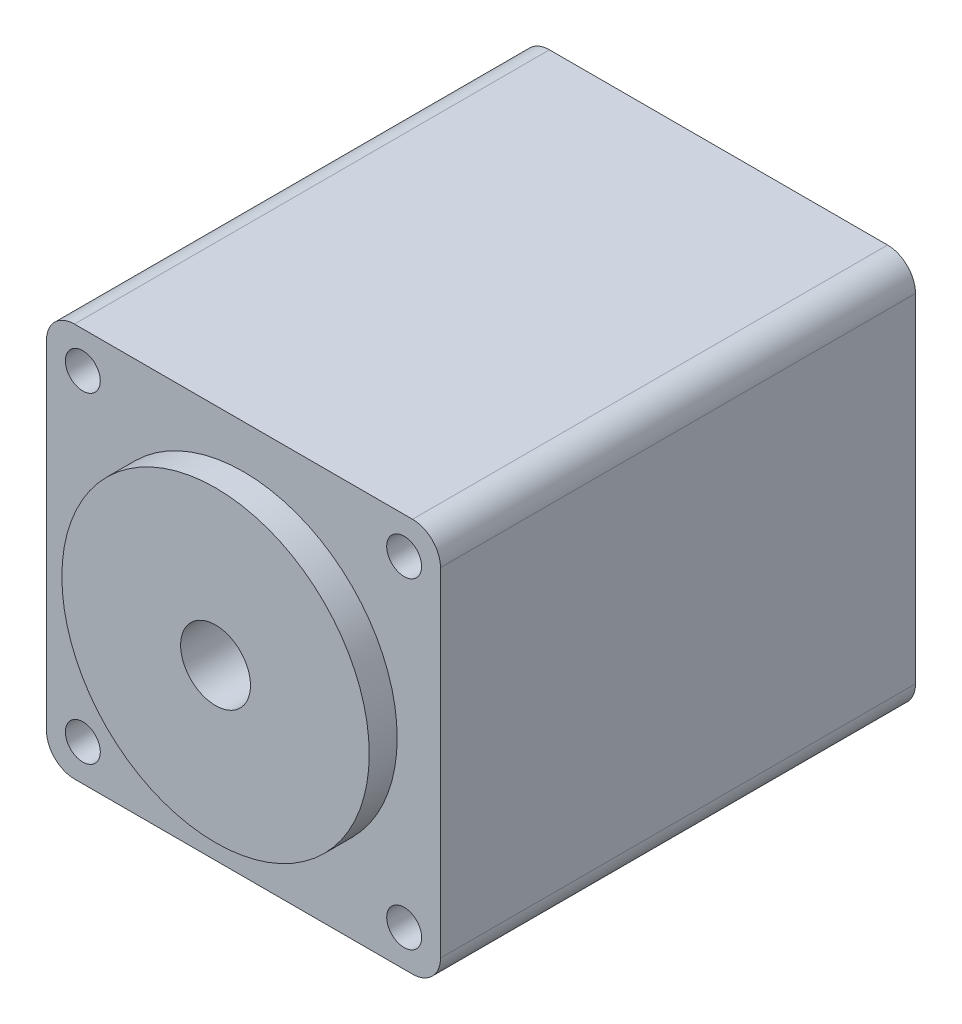
ISO-10303-21;
HEADER;
FILE_DESCRIPTION(('STEP AP214'),'2;1');
FILE_NAME('part.step','',(''),(''),'','','');
FILE_SCHEMA(('AUTOMOTIVE_DESIGN { 1 0 10303 214 1 1 1 1 }'));
ENDSEC;
DATA;
#1=APPLICATION_CONTEXT('core data for automotive mechanical design processes');
#2=APPLICATION_PROTOCOL_DEFINITION('international standard','automotive_design',2000,#1);
#3=PRODUCT_CONTEXT('',#1,'mechanical');
#4=PRODUCT('Part','Part','',(#3));
#5=PRODUCT_RELATED_PRODUCT_CATEGORY('part','',(#4));
#6=PRODUCT_DEFINITION_FORMATION('','',#4);
#7=PRODUCT_DEFINITION_CONTEXT('part definition',#1,'design');
#8=PRODUCT_DEFINITION('design','',#6,#7);
#9=PRODUCT_DEFINITION_SHAPE('','',#8);
#10=(LENGTH_UNIT() NAMED_UNIT(*) SI_UNIT(.MILLI.,.METRE.));
#11=(NAMED_UNIT(*) PLANE_ANGLE_UNIT() SI_UNIT($,.RADIAN.));
#12=(NAMED_UNIT(*) SI_UNIT($,.STERADIAN.) SOLID_ANGLE_UNIT());
#13=UNCERTAINTY_MEASURE_WITH_UNIT(LENGTH_MEASURE(1.E-05),#10,'distance_accuracy_value','');
#14=(GEOMETRIC_REPRESENTATION_CONTEXT(3) GLOBAL_UNCERTAINTY_ASSIGNED_CONTEXT((#13)) GLOBAL_UNIT_ASSIGNED_CONTEXT((#10,
#11,#12)) REPRESENTATION_CONTEXT('',''));
#15=CARTESIAN_POINT('',(0.,0.,0.));
#16=DIRECTION('',(0.,0.,1.));
#17=DIRECTION('',(1.,0.,0.));
#18=AXIS2_PLACEMENT_3D('',#15,#16,#17);
#19=CARTESIAN_POINT('',(-12.1,-12.1,34.));
#20=DIRECTION('',(0.,0.,-1.));
#21=DIRECTION('',(-1.,0.,0.));
#22=AXIS2_PLACEMENT_3D('',#19,#20,#21);
#23=CYLINDRICAL_SURFACE('',#22,2.);
#24=CARTESIAN_POINT('',(-12.1,-12.1,0.));
#25=DIRECTION('',(0.,0.,1.));
#26=DIRECTION('',(1.,0.,0.));
#27=AXIS2_PLACEMENT_3D('',#24,#25,#26);
#28=CIRCLE('',#27,2.);
#29=CARTESIAN_POINT('',(-14.1,-12.1,0.));
#30=VERTEX_POINT('',#29);
#31=CARTESIAN_POINT('',(-12.1,-14.1,0.));
#32=VERTEX_POINT('',#31);
#33=EDGE_CURVE('E130',#30,#32,#28,.T.);
#34=ORIENTED_EDGE('',*,*,#33,.T.);
#35=DIRECTION('',(0.,0.,-1.));
#36=VECTOR('',#35,1.);
#37=CARTESIAN_POINT('',(-12.1,-14.1,34.));
#38=LINE('',#37,#36);
#39=CARTESIAN_POINT('',(-12.1,-14.1,34.));
#40=VERTEX_POINT('',#39);
#41=EDGE_CURVE('E35',#40,#32,#38,.T.);
#42=ORIENTED_EDGE('',*,*,#41,.F.);
#43=CARTESIAN_POINT('',(-12.1,-12.1,34.));
#44=DIRECTION('',(0.,0.,1.));
#45=DIRECTION('',(1.,0.,0.));
#46=AXIS2_PLACEMENT_3D('',#43,#44,#45);
#47=CIRCLE('',#46,2.);
#48=CARTESIAN_POINT('',(-14.1,-12.1,34.));
#49=VERTEX_POINT('',#48);
#50=EDGE_CURVE('E145',#49,#40,#47,.T.);
#51=ORIENTED_EDGE('',*,*,#50,.F.);
#52=DIRECTION('',(0.,0.,-1.));
#53=VECTOR('',#52,1.);
#54=CARTESIAN_POINT('',(-14.1,-12.1,34.));
#55=LINE('',#54,#53);
#56=EDGE_CURVE('E126',#49,#30,#55,.T.);
#57=ORIENTED_EDGE('',*,*,#56,.T.);
#58=EDGE_LOOP('',(#34,#42,#51,#57));
#59=FACE_BOUND('',#58,.T.);
#60=ADVANCED_FACE('F32',(#59),#23,.T.);
#61=CARTESIAN_POINT('',(-12.1,-14.1,34.));
#62=DIRECTION('',(0.,1.,0.));
#63=DIRECTION('',(0.,0.,1.));
#64=AXIS2_PLACEMENT_3D('',#61,#62,#63);
#65=PLANE('',#64);
#66=DIRECTION('',(1.,0.,0.));
#67=VECTOR('',#66,1.);
#68=CARTESIAN_POINT('',(-12.1,-14.1,0.));
#69=LINE('',#68,#67);
#70=CARTESIAN_POINT('',(12.1,-14.1,0.));
#71=VERTEX_POINT('',#70);
#72=EDGE_CURVE('E133',#32,#71,#69,.T.);
#73=ORIENTED_EDGE('',*,*,#72,.T.);
#74=DIRECTION('',(0.,0.,-1.));
#75=VECTOR('',#74,1.);
#76=CARTESIAN_POINT('',(12.1,-14.1,34.));
#77=LINE('',#76,#75);
#78=CARTESIAN_POINT('',(12.1,-14.1,34.));
#79=VERTEX_POINT('',#78);
#80=EDGE_CURVE('E154',#79,#71,#77,.T.);
#81=ORIENTED_EDGE('',*,*,#80,.F.);
#82=DIRECTION('',(1.,0.,0.));
#83=VECTOR('',#82,1.);
#84=CARTESIAN_POINT('',(-12.1,-14.1,34.));
#85=LINE('',#84,#83);
#86=EDGE_CURVE('E93',#40,#79,#85,.T.);
#87=ORIENTED_EDGE('',*,*,#86,.F.);
#88=ORIENTED_EDGE('',*,*,#41,.T.);
#89=EDGE_LOOP('',(#73,#81,#87,#88));
#90=FACE_BOUND('',#89,.T.);
#91=ADVANCED_FACE('F160',(#90),#65,.F.);
#92=CARTESIAN_POINT('',(12.1,-12.1,34.));
#93=DIRECTION('',(0.,0.,-1.));
#94=DIRECTION('',(-1.,0.,0.));
#95=AXIS2_PLACEMENT_3D('',#92,#93,#94);
#96=CYLINDRICAL_SURFACE('',#95,2.);
#97=CARTESIAN_POINT('',(12.1,-12.1,0.));
#98=DIRECTION('',(0.,0.,1.));
#99=DIRECTION('',(1.,0.,0.));
#100=AXIS2_PLACEMENT_3D('',#97,#98,#99);
#101=CIRCLE('',#100,2.);
#102=CARTESIAN_POINT('',(14.1,-12.1,0.));
#103=VERTEX_POINT('',#102);
#104=EDGE_CURVE('E136',#71,#103,#101,.T.);
#105=ORIENTED_EDGE('',*,*,#104,.T.);
#106=DIRECTION('',(0.,0.,-1.));
#107=VECTOR('',#106,1.);
#108=CARTESIAN_POINT('',(14.1,-12.1,34.));
#109=LINE('',#108,#107);
#110=CARTESIAN_POINT('',(14.1,-12.1,34.));
#111=VERTEX_POINT('',#110);
#112=EDGE_CURVE('E152',#111,#103,#109,.T.);
#113=ORIENTED_EDGE('',*,*,#112,.F.);
#114=CARTESIAN_POINT('',(12.1,-12.1,34.));
#115=DIRECTION('',(0.,0.,1.));
#116=DIRECTION('',(1.,0.,0.));
#117=AXIS2_PLACEMENT_3D('',#114,#115,#116);
#118=CIRCLE('',#117,2.);
#119=EDGE_CURVE('E175',#79,#111,#118,.T.);
#120=ORIENTED_EDGE('',*,*,#119,.F.);
#121=ORIENTED_EDGE('',*,*,#80,.T.);
#122=EDGE_LOOP('',(#105,#113,#120,#121));
#123=FACE_BOUND('',#122,.T.);
#124=ADVANCED_FACE('F169',(#123),#96,.T.);
#125=CARTESIAN_POINT('',(14.1,12.1,34.));
#126=DIRECTION('',(-1.,0.,0.));
#127=DIRECTION('',(0.,0.,1.));
#128=AXIS2_PLACEMENT_3D('',#125,#126,#127);
#129=PLANE('',#128);
#130=DIRECTION('',(0.,1.,0.));
#131=VECTOR('',#130,1.);
#132=CARTESIAN_POINT('',(14.1,12.1,0.));
#133=LINE('',#132,#131);
#134=CARTESIAN_POINT('',(14.1,12.1,0.));
#135=VERTEX_POINT('',#134);
#136=EDGE_CURVE('E138',#103,#135,#133,.T.);
#137=ORIENTED_EDGE('',*,*,#136,.T.);
#138=DIRECTION('',(0.,0.,-1.));
#139=VECTOR('',#138,1.);
#140=CARTESIAN_POINT('',(14.1,12.1,34.));
#141=LINE('',#140,#139);
#142=CARTESIAN_POINT('',(14.1,12.1,34.));
#143=VERTEX_POINT('',#142);
#144=EDGE_CURVE('E149',#143,#135,#141,.T.);
#145=ORIENTED_EDGE('',*,*,#144,.F.);
#146=DIRECTION('',(0.,1.,0.));
#147=VECTOR('',#146,1.);
#148=CARTESIAN_POINT('',(14.1,12.1,34.));
#149=LINE('',#148,#147);
#150=EDGE_CURVE('E174',#111,#143,#149,.T.);
#151=ORIENTED_EDGE('',*,*,#150,.F.);
#152=ORIENTED_EDGE('',*,*,#112,.T.);
#153=EDGE_LOOP('',(#137,#145,#151,#152));
#154=FACE_BOUND('',#153,.T.);
#155=ADVANCED_FACE('F172',(#154),#129,.F.);
#156=CARTESIAN_POINT('',(12.1,12.1,34.));
#157=DIRECTION('',(0.,0.,-1.));
#158=DIRECTION('',(-1.,0.,0.));
#159=AXIS2_PLACEMENT_3D('',#156,#157,#158);
#160=CYLINDRICAL_SURFACE('',#159,2.);
#161=CARTESIAN_POINT('',(12.1,12.1,0.));
#162=DIRECTION('',(0.,0.,1.));
#163=DIRECTION('',(-1.,0.,0.));
#164=AXIS2_PLACEMENT_3D('',#161,#162,#163);
#165=CIRCLE('',#164,2.);
#166=CARTESIAN_POINT('',(12.1,14.1,0.));
#167=VERTEX_POINT('',#166);
#168=EDGE_CURVE('E140',#135,#167,#165,.T.);
#169=ORIENTED_EDGE('',*,*,#168,.T.);
#170=DIRECTION('',(0.,0.,-1.));
#171=VECTOR('',#170,1.);
#172=CARTESIAN_POINT('',(12.1,14.1,34.));
#173=LINE('',#172,#171);
#174=CARTESIAN_POINT('',(12.1,14.1,34.));
#175=VERTEX_POINT('',#174);
#176=EDGE_CURVE('E121',#175,#167,#173,.T.);
#177=ORIENTED_EDGE('',*,*,#176,.F.);
#178=CARTESIAN_POINT('',(12.1,12.1,34.));
#179=DIRECTION('',(0.,0.,1.));
#180=DIRECTION('',(-1.,0.,0.));
#181=AXIS2_PLACEMENT_3D('',#178,#179,#180);
#182=CIRCLE('',#181,2.);
#183=EDGE_CURVE('E112',#143,#175,#182,.T.);
#184=ORIENTED_EDGE('',*,*,#183,.F.);
#185=ORIENTED_EDGE('',*,*,#144,.T.);
#186=EDGE_LOOP('',(#169,#177,#184,#185));
#187=FACE_BOUND('',#186,.T.);
#188=ADVANCED_FACE('F257',(#187),#160,.T.);
#189=CARTESIAN_POINT('',(-12.1,14.1,34.));
#190=DIRECTION('',(0.,-1.,0.));
#191=DIRECTION('',(0.,0.,-1.));
#192=AXIS2_PLACEMENT_3D('',#189,#190,#191);
#193=PLANE('',#192);
#194=DIRECTION('',(-1.,0.,0.));
#195=VECTOR('',#194,1.);
#196=CARTESIAN_POINT('',(-12.1,14.1,0.));
#197=LINE('',#196,#195);
#198=CARTESIAN_POINT('',(-12.1,14.1,0.));
#199=VERTEX_POINT('',#198);
#200=EDGE_CURVE('E120',#167,#199,#197,.T.);
#201=ORIENTED_EDGE('',*,*,#200,.T.);
#202=DIRECTION('',(0.,0.,-1.));
#203=VECTOR('',#202,1.);
#204=CARTESIAN_POINT('',(-12.1,14.1,34.));
#205=LINE('',#204,#203);
#206=CARTESIAN_POINT('',(-12.1,14.1,34.));
#207=VERTEX_POINT('',#206);
#208=EDGE_CURVE('E117',#207,#199,#205,.T.);
#209=ORIENTED_EDGE('',*,*,#208,.F.);
#210=DIRECTION('',(-1.,0.,0.));
#211=VECTOR('',#210,1.);
#212=CARTESIAN_POINT('',(-12.1,14.1,34.));
#213=LINE('',#212,#211);
#214=EDGE_CURVE('E106',#175,#207,#213,.T.);
#215=ORIENTED_EDGE('',*,*,#214,.F.);
#216=ORIENTED_EDGE('',*,*,#176,.T.);
#217=EDGE_LOOP('',(#201,#209,#215,#216));
#218=FACE_BOUND('',#217,.T.);
#219=ADVANCED_FACE('F118',(#218),#193,.F.);
#220=CARTESIAN_POINT('',(-12.1,12.1,34.));
#221=DIRECTION('',(0.,0.,-1.));
#222=DIRECTION('',(-1.,0.,0.));
#223=AXIS2_PLACEMENT_3D('',#220,#221,#222);
#224=CYLINDRICAL_SURFACE('',#223,2.);
#225=CARTESIAN_POINT('',(-12.1,12.1,0.));
#226=DIRECTION('',(0.,0.,1.));
#227=DIRECTION('',(1.,0.,0.));
#228=AXIS2_PLACEMENT_3D('',#225,#226,#227);
#229=CIRCLE('',#228,2.);
#230=CARTESIAN_POINT('',(-14.1,12.1,0.));
#231=VERTEX_POINT('',#230);
#232=EDGE_CURVE('E78',#199,#231,#229,.T.);
#233=ORIENTED_EDGE('',*,*,#232,.T.);
#234=DIRECTION('',(0.,0.,-1.));
#235=VECTOR('',#234,1.);
#236=CARTESIAN_POINT('',(-14.1,12.1,34.));
#237=LINE('',#236,#235);
#238=CARTESIAN_POINT('',(-14.1,12.1,34.));
#239=VERTEX_POINT('',#238);
#240=EDGE_CURVE('E122',#239,#231,#237,.T.);
#241=ORIENTED_EDGE('',*,*,#240,.F.);
#242=CARTESIAN_POINT('',(-12.1,12.1,34.));
#243=DIRECTION('',(0.,0.,1.));
#244=DIRECTION('',(1.,0.,0.));
#245=AXIS2_PLACEMENT_3D('',#242,#243,#244);
#246=CIRCLE('',#245,2.);
#247=EDGE_CURVE('E110',#207,#239,#246,.T.);
#248=ORIENTED_EDGE('',*,*,#247,.F.);
#249=ORIENTED_EDGE('',*,*,#208,.T.);
#250=EDGE_LOOP('',(#233,#241,#248,#249));
#251=FACE_BOUND('',#250,.T.);
#252=ADVANCED_FACE('F124',(#251),#224,.T.);
#253=CARTESIAN_POINT('',(-14.1,12.1,34.));
#254=DIRECTION('',(1.,0.,0.));
#255=DIRECTION('',(0.,0.,-1.));
#256=AXIS2_PLACEMENT_3D('',#253,#254,#255);
#257=PLANE('',#256);
#258=DIRECTION('',(0.,-1.,0.));
#259=VECTOR('',#258,1.);
#260=CARTESIAN_POINT('',(-14.1,12.1,0.));
#261=LINE('',#260,#259);
#262=EDGE_CURVE('E84',#231,#30,#261,.T.);
#263=ORIENTED_EDGE('',*,*,#262,.T.);
#264=ORIENTED_EDGE('',*,*,#56,.F.);
#265=DIRECTION('',(0.,-1.,0.));
#266=VECTOR('',#265,1.);
#267=CARTESIAN_POINT('',(-14.1,12.1,34.));
#268=LINE('',#267,#266);
#269=EDGE_CURVE('E49',#239,#49,#268,.T.);
#270=ORIENTED_EDGE('',*,*,#269,.F.);
#271=ORIENTED_EDGE('',*,*,#240,.T.);
#272=EDGE_LOOP('',(#263,#264,#270,#271));
#273=FACE_BOUND('',#272,.T.);
#274=ADVANCED_FACE('F225',(#273),#257,.F.);
#275=CARTESIAN_POINT('',(-12.1,-12.1,34.));
#276=DIRECTION('',(0.,0.,1.));
#277=DIRECTION('',(1.,0.,0.));
#278=AXIS2_PLACEMENT_3D('',#275,#276,#277);
#279=PLANE('',#278);
#280=CARTESIAN_POINT('',(-11.5,-11.5,34.));
#281=DIRECTION('',(0.,0.,1.));
#282=DIRECTION('',(-1.,0.,0.));
#283=AXIS2_PLACEMENT_3D('',#280,#281,#282);
#284=CIRCLE('',#283,1.25);
#285=CARTESIAN_POINT('',(-12.75,-11.5,34.));
#286=VERTEX_POINT('',#285);
#287=EDGE_CURVE('E196',#286,#286,#284,.T.);
#288=ORIENTED_EDGE('',*,*,#287,.F.);
#289=EDGE_LOOP('',(#288));
#290=FACE_BOUND('',#289,.T.);
#291=CARTESIAN_POINT('',(11.5,-11.5,34.));
#292=DIRECTION('',(0.,0.,1.));
#293=DIRECTION('',(-1.,0.,0.));
#294=AXIS2_PLACEMENT_3D('',#291,#292,#293);
#295=CIRCLE('',#294,1.25);
#296=CARTESIAN_POINT('',(10.25,-11.5,34.));
#297=VERTEX_POINT('',#296);
#298=EDGE_CURVE('E202',#297,#297,#295,.T.);
#299=ORIENTED_EDGE('',*,*,#298,.F.);
#300=EDGE_LOOP('',(#299));
#301=FACE_BOUND('',#300,.T.);
#302=CARTESIAN_POINT('',(11.5,11.5,34.));
#303=DIRECTION('',(0.,0.,1.));
#304=DIRECTION('',(1.,0.,0.));
#305=AXIS2_PLACEMENT_3D('',#302,#303,#304);
#306=CIRCLE('',#305,1.25);
#307=CARTESIAN_POINT('',(12.75,11.5,34.));
#308=VERTEX_POINT('',#307);
#309=EDGE_CURVE('E208',#308,#308,#306,.T.);
#310=ORIENTED_EDGE('',*,*,#309,.F.);
#311=EDGE_LOOP('',(#310));
#312=FACE_BOUND('',#311,.T.);
#313=CARTESIAN_POINT('',(-11.5,11.5,34.));
#314=DIRECTION('',(0.,0.,1.));
#315=DIRECTION('',(1.,0.,0.));
#316=AXIS2_PLACEMENT_3D('',#313,#314,#315);
#317=CIRCLE('',#316,1.25);
#318=CARTESIAN_POINT('',(-10.25,11.5,34.));
#319=VERTEX_POINT('',#318);
#320=EDGE_CURVE('E190',#319,#319,#317,.T.);
#321=ORIENTED_EDGE('',*,*,#320,.F.);
#322=EDGE_LOOP('',(#321));
#323=FACE_BOUND('',#322,.T.);
#324=CARTESIAN_POINT('',(0.,0.,34.));
#325=DIRECTION('',(0.,0.,1.));
#326=DIRECTION('',(1.,0.,0.));
#327=AXIS2_PLACEMENT_3D('',#324,#325,#326);
#328=CIRCLE('',#327,11.);
#329=CARTESIAN_POINT('',(11.,0.,34.));
#330=VERTEX_POINT('',#329);
#331=EDGE_CURVE('E11',#330,#330,#328,.T.);
#332=ORIENTED_EDGE('',*,*,#331,.F.);
#333=EDGE_LOOP('',(#332));
#334=FACE_BOUND('',#333,.T.);
#335=ORIENTED_EDGE('',*,*,#50,.T.);
#336=ORIENTED_EDGE('',*,*,#86,.T.);
#337=ORIENTED_EDGE('',*,*,#119,.T.);
#338=ORIENTED_EDGE('',*,*,#150,.T.);
#339=ORIENTED_EDGE('',*,*,#183,.T.);
#340=ORIENTED_EDGE('',*,*,#214,.T.);
#341=ORIENTED_EDGE('',*,*,#247,.T.);
#342=ORIENTED_EDGE('',*,*,#269,.T.);
#343=EDGE_LOOP('',(#335,#336,#337,#338,#339,#340,#341,#342));
#344=FACE_BOUND('',#343,.T.);
#345=ADVANCED_FACE('F108',(#290,#301,#312,#323,#334,#344),#279,.T.);
#346=CARTESIAN_POINT('',(-12.1,-12.1,0.));
#347=DIRECTION('',(0.,0.,1.));
#348=DIRECTION('',(1.,0.,0.));
#349=AXIS2_PLACEMENT_3D('',#346,#347,#348);
#350=PLANE('',#349);
#351=ORIENTED_EDGE('',*,*,#33,.F.);
#352=ORIENTED_EDGE('',*,*,#262,.F.);
#353=ORIENTED_EDGE('',*,*,#232,.F.);
#354=ORIENTED_EDGE('',*,*,#200,.F.);
#355=ORIENTED_EDGE('',*,*,#168,.F.);
#356=ORIENTED_EDGE('',*,*,#136,.F.);
#357=ORIENTED_EDGE('',*,*,#104,.F.);
#358=ORIENTED_EDGE('',*,*,#72,.F.);
#359=EDGE_LOOP('',(#351,#352,#353,#354,#355,#356,#357,#358));
#360=FACE_BOUND('',#359,.T.);
#361=ADVANCED_FACE('F165',(#360),#350,.F.);
#362=CARTESIAN_POINT('',(0.,0.,36.));
#363=DIRECTION('',(0.,0.,-1.));
#364=DIRECTION('',(-1.,0.,0.));
#365=AXIS2_PLACEMENT_3D('',#362,#363,#364);
#366=CYLINDRICAL_SURFACE('',#365,11.);
#367=CARTESIAN_POINT('',(0.,0.,36.));
#368=DIRECTION('',(0.,0.,1.));
#369=DIRECTION('',(1.,0.,0.));
#370=AXIS2_PLACEMENT_3D('',#367,#368,#369);
#371=CIRCLE('',#370,11.);
#372=CARTESIAN_POINT('',(11.,0.,36.));
#373=VERTEX_POINT('',#372);
#374=EDGE_CURVE('E134',#373,#373,#371,.T.);
#375=ORIENTED_EDGE('',*,*,#374,.F.);
#376=EDGE_LOOP('',(#375));
#377=FACE_BOUND('',#376,.T.);
#378=ORIENTED_EDGE('',*,*,#331,.T.);
#379=EDGE_LOOP('',(#378));
#380=FACE_BOUND('',#379,.T.);
#381=ADVANCED_FACE('F232',(#377,#380),#366,.T.);
#382=CARTESIAN_POINT('',(0.,0.,36.));
#383=DIRECTION('',(0.,0.,1.));
#384=DIRECTION('',(1.,0.,0.));
#385=AXIS2_PLACEMENT_3D('',#382,#383,#384);
#386=PLANE('',#385);
#387=CARTESIAN_POINT('',(0.,0.,36.));
#388=DIRECTION('',(0.,0.,1.));
#389=DIRECTION('',(1.,0.,0.));
#390=AXIS2_PLACEMENT_3D('',#387,#388,#389);
#391=CIRCLE('',#390,2.5);
#392=CARTESIAN_POINT('',(2.5,0.,36.));
#393=VERTEX_POINT('',#392);
#394=EDGE_CURVE('E184',#393,#393,#391,.T.);
#395=ORIENTED_EDGE('',*,*,#394,.F.);
#396=EDGE_LOOP('',(#395));
#397=FACE_BOUND('',#396,.T.);
#398=ORIENTED_EDGE('',*,*,#374,.T.);
#399=EDGE_LOOP('',(#398));
#400=FACE_BOUND('',#399,.T.);
#401=ADVANCED_FACE('F234',(#397,#400),#386,.T.);
#402=CARTESIAN_POINT('',(0.,0.,26.));
#403=DIRECTION('',(0.,0.,1.));
#404=DIRECTION('',(1.,0.,0.));
#405=AXIS2_PLACEMENT_3D('',#402,#403,#404);
#406=CYLINDRICAL_SURFACE('',#405,2.5);
#407=CARTESIAN_POINT('',(0.,0.,26.));
#408=DIRECTION('',(0.,0.,1.));
#409=DIRECTION('',(1.,0.,0.));
#410=AXIS2_PLACEMENT_3D('',#407,#408,#409);
#411=CIRCLE('',#410,2.5);
#412=CARTESIAN_POINT('',(2.5,0.,26.));
#413=VERTEX_POINT('',#412);
#414=EDGE_CURVE('E183',#413,#413,#411,.T.);
#415=ORIENTED_EDGE('',*,*,#414,.F.);
#416=EDGE_LOOP('',(#415));
#417=FACE_BOUND('',#416,.T.);
#418=ORIENTED_EDGE('',*,*,#394,.T.);
#419=EDGE_LOOP('',(#418));
#420=FACE_BOUND('',#419,.T.);
#421=ADVANCED_FACE('F241',(#417,#420),#406,.F.);
#422=CARTESIAN_POINT('',(0.,0.,26.));
#423=DIRECTION('',(0.,0.,1.));
#424=DIRECTION('',(1.,0.,0.));
#425=AXIS2_PLACEMENT_3D('',#422,#423,#424);
#426=PLANE('',#425);
#427=ORIENTED_EDGE('',*,*,#414,.T.);
#428=EDGE_LOOP('',(#427));
#429=FACE_BOUND('',#428,.T.);
#430=ADVANCED_FACE('F298',(#429),#426,.T.);
#431=CARTESIAN_POINT('',(-11.5,11.5,24.));
#432=DIRECTION('',(0.,0.,1.));
#433=DIRECTION('',(1.,0.,0.));
#434=AXIS2_PLACEMENT_3D('',#431,#432,#433);
#435=CYLINDRICAL_SURFACE('',#434,1.25);
#436=CARTESIAN_POINT('',(-11.5,11.5,24.));
#437=DIRECTION('',(0.,0.,1.));
#438=DIRECTION('',(1.,0.,0.));
#439=AXIS2_PLACEMENT_3D('',#436,#437,#438);
#440=CIRCLE('',#439,1.25);
#441=CARTESIAN_POINT('',(-10.25,11.5,24.));
#442=VERTEX_POINT('',#441);
#443=EDGE_CURVE('E187',#442,#442,#440,.T.);
#444=ORIENTED_EDGE('',*,*,#443,.F.);
#445=EDGE_LOOP('',(#444));
#446=FACE_BOUND('',#445,.T.);
#447=ORIENTED_EDGE('',*,*,#320,.T.);
#448=EDGE_LOOP('',(#447));
#449=FACE_BOUND('',#448,.T.);
#450=ADVANCED_FACE('F307',(#446,#449),#435,.F.);
#451=CARTESIAN_POINT('',(-11.5,11.5,24.));
#452=DIRECTION('',(0.,0.,1.));
#453=DIRECTION('',(1.,0.,0.));
#454=AXIS2_PLACEMENT_3D('',#451,#452,#453);
#455=PLANE('',#454);
#456=ORIENTED_EDGE('',*,*,#443,.T.);
#457=EDGE_LOOP('',(#456));
#458=FACE_BOUND('',#457,.T.);
#459=ADVANCED_FACE('F219',(#458),#455,.T.);
#460=CARTESIAN_POINT('',(11.5,11.5,24.));
#461=DIRECTION('',(0.,0.,1.));
#462=DIRECTION('',(1.,0.,0.));
#463=AXIS2_PLACEMENT_3D('',#460,#461,#462);
#464=CYLINDRICAL_SURFACE('',#463,1.25);
#465=CARTESIAN_POINT('',(11.5,11.5,24.));
#466=DIRECTION('',(0.,0.,1.));
#467=DIRECTION('',(1.,0.,0.));
#468=AXIS2_PLACEMENT_3D('',#465,#466,#467);
#469=CIRCLE('',#468,1.25);
#470=CARTESIAN_POINT('',(12.75,11.5,24.));
#471=VERTEX_POINT('',#470);
#472=EDGE_CURVE('E193',#471,#471,#469,.T.);
#473=ORIENTED_EDGE('',*,*,#472,.F.);
#474=EDGE_LOOP('',(#473));
#475=FACE_BOUND('',#474,.T.);
#476=ORIENTED_EDGE('',*,*,#309,.T.);
#477=EDGE_LOOP('',(#476));
#478=FACE_BOUND('',#477,.T.);
#479=ADVANCED_FACE('F216',(#475,#478),#464,.F.);
#480=CARTESIAN_POINT('',(11.5,11.5,24.));
#481=DIRECTION('',(0.,0.,1.));
#482=DIRECTION('',(1.,0.,0.));
#483=AXIS2_PLACEMENT_3D('',#480,#481,#482);
#484=PLANE('',#483);
#485=ORIENTED_EDGE('',*,*,#472,.T.);
#486=EDGE_LOOP('',(#485));
#487=FACE_BOUND('',#486,.T.);
#488=ADVANCED_FACE('F214',(#487),#484,.T.);
#489=CARTESIAN_POINT('',(11.5,-11.5,24.));
#490=DIRECTION('',(0.,0.,1.));
#491=DIRECTION('',(1.,0.,0.));
#492=AXIS2_PLACEMENT_3D('',#489,#490,#491);
#493=CYLINDRICAL_SURFACE('',#492,1.25);
#494=CARTESIAN_POINT('',(11.5,-11.5,24.));
#495=DIRECTION('',(0.,0.,1.));
#496=DIRECTION('',(-1.,0.,0.));
#497=AXIS2_PLACEMENT_3D('',#494,#495,#496);
#498=CIRCLE('',#497,1.25);
#499=CARTESIAN_POINT('',(10.25,-11.5,24.));
#500=VERTEX_POINT('',#499);
#501=EDGE_CURVE('E205',#500,#500,#498,.T.);
#502=ORIENTED_EDGE('',*,*,#501,.F.);
#503=EDGE_LOOP('',(#502));
#504=FACE_BOUND('',#503,.T.);
#505=ORIENTED_EDGE('',*,*,#298,.T.);
#506=EDGE_LOOP('',(#505));
#507=FACE_BOUND('',#506,.T.);
#508=ADVANCED_FACE('F334',(#504,#507),#493,.F.);
#509=CARTESIAN_POINT('',(11.5,-11.5,24.));
#510=DIRECTION('',(0.,0.,-1.));
#511=DIRECTION('',(-1.,0.,0.));
#512=AXIS2_PLACEMENT_3D('',#509,#510,#511);
#513=PLANE('',#512);
#514=ORIENTED_EDGE('',*,*,#501,.T.);
#515=EDGE_LOOP('',(#514));
#516=FACE_BOUND('',#515,.T.);
#517=ADVANCED_FACE('F341',(#516),#513,.F.);
#518=CARTESIAN_POINT('',(-11.5,-11.5,24.));
#519=DIRECTION('',(0.,0.,1.));
#520=DIRECTION('',(1.,0.,0.));
#521=AXIS2_PLACEMENT_3D('',#518,#519,#520);
#522=CYLINDRICAL_SURFACE('',#521,1.25);
#523=CARTESIAN_POINT('',(-11.5,-11.5,24.));
#524=DIRECTION('',(0.,0.,1.));
#525=DIRECTION('',(-1.,0.,0.));
#526=AXIS2_PLACEMENT_3D('',#523,#524,#525);
#527=CIRCLE('',#526,1.25);
#528=CARTESIAN_POINT('',(-12.75,-11.5,24.));
#529=VERTEX_POINT('',#528);
#530=EDGE_CURVE('E199',#529,#529,#527,.T.);
#531=ORIENTED_EDGE('',*,*,#530,.F.);
#532=EDGE_LOOP('',(#531));
#533=FACE_BOUND('',#532,.T.);
#534=ORIENTED_EDGE('',*,*,#287,.T.);
#535=EDGE_LOOP('',(#534));
#536=FACE_BOUND('',#535,.T.);
#537=ADVANCED_FACE('F349',(#533,#536),#522,.F.);
#538=CARTESIAN_POINT('',(-11.5,-11.5,24.));
#539=DIRECTION('',(0.,0.,-1.));
#540=DIRECTION('',(-1.,0.,0.));
#541=AXIS2_PLACEMENT_3D('',#538,#539,#540);
#542=PLANE('',#541);
#543=ORIENTED_EDGE('',*,*,#530,.T.);
#544=EDGE_LOOP('',(#543));
#545=FACE_BOUND('',#544,.T.);
#546=ADVANCED_FACE('F357',(#545),#542,.F.);
#547=CLOSED_SHELL('',(#60,#91,#124,#155,#188,#219,#252,#274,#345,#361,#381,#401,#421,#430,#450,
#459,#479,#488,#508,#517,#537,#546));
#548=MANIFOLD_SOLID_BREP('B2',#547);
#549=ADVANCED_BREP_SHAPE_REPRESENTATION('',(#18,#548),#14);
#550=SHAPE_DEFINITION_REPRESENTATION(#9,#549);
ENDSEC;
END-ISO-10303-21;
